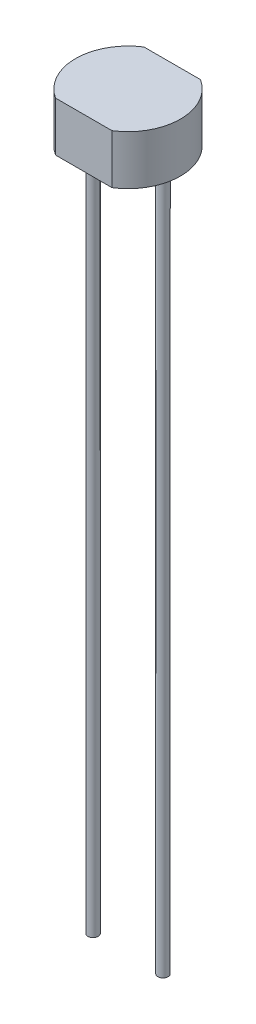
ISO-10303-21;
HEADER;
FILE_DESCRIPTION(('STEP AP214'),'2;1');
FILE_NAME('part.step','',(''),(''),'','','');
FILE_SCHEMA(('AUTOMOTIVE_DESIGN { 1 0 10303 214 1 1 1 1 }'));
ENDSEC;
DATA;
#1=APPLICATION_CONTEXT('core data for automotive mechanical design processes');
#2=APPLICATION_PROTOCOL_DEFINITION('international standard','automotive_design',2000,#1);
#3=PRODUCT_CONTEXT('',#1,'mechanical');
#4=PRODUCT('Part','Part','',(#3));
#5=PRODUCT_RELATED_PRODUCT_CATEGORY('part','',(#4));
#6=PRODUCT_DEFINITION_FORMATION('','',#4);
#7=PRODUCT_DEFINITION_CONTEXT('part definition',#1,'design');
#8=PRODUCT_DEFINITION('design','',#6,#7);
#9=PRODUCT_DEFINITION_SHAPE('','',#8);
#10=(LENGTH_UNIT() NAMED_UNIT(*) SI_UNIT(.MILLI.,.METRE.));
#11=(NAMED_UNIT(*) PLANE_ANGLE_UNIT() SI_UNIT($,.RADIAN.));
#12=(NAMED_UNIT(*) SI_UNIT($,.STERADIAN.) SOLID_ANGLE_UNIT());
#13=UNCERTAINTY_MEASURE_WITH_UNIT(LENGTH_MEASURE(1.E-05),#10,'distance_accuracy_value','');
#14=(GEOMETRIC_REPRESENTATION_CONTEXT(3) GLOBAL_UNCERTAINTY_ASSIGNED_CONTEXT((#13)) GLOBAL_UNIT_ASSIGNED_CONTEXT((#10,
#11,#12)) REPRESENTATION_CONTEXT('',''));
#15=CARTESIAN_POINT('',(0.,0.,0.));
#16=DIRECTION('',(0.,0.,1.));
#17=DIRECTION('',(1.,0.,0.));
#18=AXIS2_PLACEMENT_3D('',#15,#16,#17);
#19=CARTESIAN_POINT('',(0.,2.4,2.15));
#20=DIRECTION('',(0.,0.,1.));
#21=DIRECTION('',(1.,0.,0.));
#22=AXIS2_PLACEMENT_3D('',#19,#20,#21);
#23=PLANE('',#22);
#24=DIRECTION('',(-1.,0.,0.));
#25=VECTOR('',#24,1.);
#26=CARTESIAN_POINT('',(0.,0.,2.15));
#27=LINE('',#26,#25);
#28=CARTESIAN_POINT('',(1.37113092008021,0.,2.15));
#29=VERTEX_POINT('',#28);
#30=CARTESIAN_POINT('',(-1.37113092008021,0.,2.15));
#31=VERTEX_POINT('',#30);
#32=EDGE_CURVE('E100',#29,#31,#27,.T.);
#33=ORIENTED_EDGE('',*,*,#32,.F.);
#34=DIRECTION('',(0.,-1.,0.));
#35=VECTOR('',#34,1.);
#36=CARTESIAN_POINT('',(1.37113092008021,2.4,2.15));
#37=LINE('',#36,#35);
#38=CARTESIAN_POINT('',(1.37113092008021,2.4,2.15));
#39=VERTEX_POINT('',#38);
#40=EDGE_CURVE('E79',#39,#29,#37,.T.);
#41=ORIENTED_EDGE('',*,*,#40,.F.);
#42=DIRECTION('',(-1.,0.,0.));
#43=VECTOR('',#42,1.);
#44=CARTESIAN_POINT('',(0.,2.4,2.15));
#45=LINE('',#44,#43);
#46=CARTESIAN_POINT('',(-1.37113092008021,2.4,2.15));
#47=VERTEX_POINT('',#46);
#48=EDGE_CURVE('E87',#39,#47,#45,.T.);
#49=ORIENTED_EDGE('',*,*,#48,.T.);
#50=DIRECTION('',(0.,-1.,0.));
#51=VECTOR('',#50,1.);
#52=CARTESIAN_POINT('',(-1.37113092008021,2.4,2.15));
#53=LINE('',#52,#51);
#54=EDGE_CURVE('E75',#47,#31,#53,.T.);
#55=ORIENTED_EDGE('',*,*,#54,.T.);
#56=EDGE_LOOP('',(#33,#41,#49,#55));
#57=FACE_BOUND('',#56,.T.);
#58=ADVANCED_FACE('F35',(#57),#23,.T.);
#59=CARTESIAN_POINT('',(0.,2.4,0.));
#60=DIRECTION('',(0.,-1.,0.));
#61=DIRECTION('',(0.,0.,-1.));
#62=AXIS2_PLACEMENT_3D('',#59,#60,#61);
#63=CYLINDRICAL_SURFACE('',#62,2.55);
#64=CARTESIAN_POINT('',(0.,0.,0.));
#65=DIRECTION('',(0.,1.,0.));
#66=DIRECTION('',(0.,0.,1.));
#67=AXIS2_PLACEMENT_3D('',#64,#65,#66);
#68=CIRCLE('',#67,2.55);
#69=CARTESIAN_POINT('',(1.37113092008021,0.,-2.15));
#70=VERTEX_POINT('',#69);
#71=EDGE_CURVE('E93',#29,#70,#68,.T.);
#72=ORIENTED_EDGE('',*,*,#71,.T.);
#73=DIRECTION('',(0.,-1.,0.));
#74=VECTOR('',#73,1.);
#75=CARTESIAN_POINT('',(1.37113092008021,2.4,-2.15));
#76=LINE('',#75,#74);
#77=CARTESIAN_POINT('',(1.37113092008021,2.4,-2.15));
#78=VERTEX_POINT('',#77);
#79=EDGE_CURVE('E90',#78,#70,#76,.T.);
#80=ORIENTED_EDGE('',*,*,#79,.F.);
#81=CARTESIAN_POINT('',(0.,2.4,0.));
#82=DIRECTION('',(0.,1.,0.));
#83=DIRECTION('',(0.,0.,1.));
#84=AXIS2_PLACEMENT_3D('',#81,#82,#83);
#85=CIRCLE('',#84,2.55);
#86=EDGE_CURVE('E82',#39,#78,#85,.T.);
#87=ORIENTED_EDGE('',*,*,#86,.F.);
#88=ORIENTED_EDGE('',*,*,#40,.T.);
#89=EDGE_LOOP('',(#72,#80,#87,#88));
#90=FACE_BOUND('',#89,.T.);
#91=ADVANCED_FACE('F91',(#90),#63,.T.);
#92=CARTESIAN_POINT('',(0.,2.4,-2.15));
#93=DIRECTION('',(0.,0.,1.));
#94=DIRECTION('',(1.,0.,0.));
#95=AXIS2_PLACEMENT_3D('',#92,#93,#94);
#96=PLANE('',#95);
#97=DIRECTION('',(-1.,0.,0.));
#98=VECTOR('',#97,1.);
#99=CARTESIAN_POINT('',(0.,0.,-2.15));
#100=LINE('',#99,#98);
#101=CARTESIAN_POINT('',(-1.37113092008021,0.,-2.15));
#102=VERTEX_POINT('',#101);
#103=EDGE_CURVE('E68',#70,#102,#100,.T.);
#104=ORIENTED_EDGE('',*,*,#103,.T.);
#105=DIRECTION('',(0.,-1.,0.));
#106=VECTOR('',#105,1.);
#107=CARTESIAN_POINT('',(-1.37113092008021,2.4,-2.15));
#108=LINE('',#107,#106);
#109=CARTESIAN_POINT('',(-1.37113092008021,2.4,-2.15));
#110=VERTEX_POINT('',#109);
#111=EDGE_CURVE('E94',#110,#102,#108,.T.);
#112=ORIENTED_EDGE('',*,*,#111,.F.);
#113=DIRECTION('',(-1.,0.,0.));
#114=VECTOR('',#113,1.);
#115=CARTESIAN_POINT('',(0.,2.4,-2.15));
#116=LINE('',#115,#114);
#117=EDGE_CURVE('E86',#78,#110,#116,.T.);
#118=ORIENTED_EDGE('',*,*,#117,.F.);
#119=ORIENTED_EDGE('',*,*,#79,.T.);
#120=EDGE_LOOP('',(#104,#112,#118,#119));
#121=FACE_BOUND('',#120,.T.);
#122=ADVANCED_FACE('F96',(#121),#96,.F.);
#123=EDGE_CURVE('E105',#102,#31,#68,.T.);
#124=ORIENTED_EDGE('',*,*,#123,.T.);
#125=ORIENTED_EDGE('',*,*,#54,.F.);
#126=EDGE_CURVE('E51',#110,#47,#85,.T.);
#127=ORIENTED_EDGE('',*,*,#126,.F.);
#128=ORIENTED_EDGE('',*,*,#111,.T.);
#129=EDGE_LOOP('',(#124,#125,#127,#128));
#130=FACE_BOUND('',#129,.T.);
#131=ADVANCED_FACE('F125',(#130),#63,.T.);
#132=CARTESIAN_POINT('',(0.,2.4,0.));
#133=DIRECTION('',(0.,1.,0.));
#134=DIRECTION('',(0.,0.,1.));
#135=AXIS2_PLACEMENT_3D('',#132,#133,#134);
#136=PLANE('',#135);
#137=ORIENTED_EDGE('',*,*,#48,.F.);
#138=ORIENTED_EDGE('',*,*,#86,.T.);
#139=ORIENTED_EDGE('',*,*,#117,.T.);
#140=ORIENTED_EDGE('',*,*,#126,.T.);
#141=EDGE_LOOP('',(#137,#138,#139,#140));
#142=FACE_BOUND('',#141,.T.);
#143=ADVANCED_FACE('F84',(#142),#136,.T.);
#144=CARTESIAN_POINT('',(0.,0.,0.));
#145=DIRECTION('',(0.,1.,0.));
#146=DIRECTION('',(0.,0.,1.));
#147=AXIS2_PLACEMENT_3D('',#144,#145,#146);
#148=PLANE('',#147);
#149=CARTESIAN_POINT('',(-1.7,0.,0.));
#150=DIRECTION('',(0.,1.,0.));
#151=DIRECTION('',(0.,0.,1.));
#152=AXIS2_PLACEMENT_3D('',#149,#150,#151);
#153=CIRCLE('',#152,0.25);
#154=CARTESIAN_POINT('',(-1.7,0.,0.25));
#155=VERTEX_POINT('',#154);
#156=EDGE_CURVE('E11',#155,#155,#153,.F.);
#157=ORIENTED_EDGE('',*,*,#156,.F.);
#158=EDGE_LOOP('',(#157));
#159=FACE_BOUND('',#158,.T.);
#160=CARTESIAN_POINT('',(1.7,0.,0.));
#161=DIRECTION('',(0.,1.,0.));
#162=DIRECTION('',(0.,0.,1.));
#163=AXIS2_PLACEMENT_3D('',#160,#161,#162);
#164=CIRCLE('',#163,0.25);
#165=CARTESIAN_POINT('',(1.7,0.,0.25));
#166=VERTEX_POINT('',#165);
#167=EDGE_CURVE('E43',#166,#166,#164,.F.);
#168=ORIENTED_EDGE('',*,*,#167,.F.);
#169=EDGE_LOOP('',(#168));
#170=FACE_BOUND('',#169,.T.);
#171=ORIENTED_EDGE('',*,*,#32,.T.);
#172=ORIENTED_EDGE('',*,*,#123,.F.);
#173=ORIENTED_EDGE('',*,*,#103,.F.);
#174=ORIENTED_EDGE('',*,*,#71,.F.);
#175=EDGE_LOOP('',(#171,#172,#173,#174));
#176=FACE_BOUND('',#175,.T.);
#177=ADVANCED_FACE('F114',(#159,#170,#176),#148,.F.);
#178=CARTESIAN_POINT('',(1.7,-34.,0.));
#179=DIRECTION('',(0.,1.,0.));
#180=DIRECTION('',(0.,0.,1.));
#181=AXIS2_PLACEMENT_3D('',#178,#179,#180);
#182=CYLINDRICAL_SURFACE('',#181,0.25);
#183=CARTESIAN_POINT('',(1.7,-34.,0.));
#184=DIRECTION('',(0.,-1.,0.));
#185=DIRECTION('',(0.,0.,-1.));
#186=AXIS2_PLACEMENT_3D('',#183,#184,#185);
#187=CIRCLE('',#186,0.25);
#188=CARTESIAN_POINT('',(1.7,-34.,-0.25));
#189=VERTEX_POINT('',#188);
#190=EDGE_CURVE('E103',#189,#189,#187,.T.);
#191=ORIENTED_EDGE('',*,*,#190,.F.);
#192=EDGE_LOOP('',(#191));
#193=FACE_BOUND('',#192,.T.);
#194=ORIENTED_EDGE('',*,*,#167,.T.);
#195=EDGE_LOOP('',(#194));
#196=FACE_BOUND('',#195,.T.);
#197=ADVANCED_FACE('F112',(#193,#196),#182,.T.);
#198=CARTESIAN_POINT('',(1.7,-34.,0.));
#199=DIRECTION('',(0.,-1.,0.));
#200=DIRECTION('',(0.,0.,-1.));
#201=AXIS2_PLACEMENT_3D('',#198,#199,#200);
#202=PLANE('',#201);
#203=ORIENTED_EDGE('',*,*,#190,.T.);
#204=EDGE_LOOP('',(#203));
#205=FACE_BOUND('',#204,.T.);
#206=ADVANCED_FACE('F147',(#205),#202,.T.);
#207=CARTESIAN_POINT('',(-1.7,-34.,0.));
#208=DIRECTION('',(0.,1.,0.));
#209=DIRECTION('',(0.,0.,1.));
#210=AXIS2_PLACEMENT_3D('',#207,#208,#209);
#211=CYLINDRICAL_SURFACE('',#210,0.25);
#212=CARTESIAN_POINT('',(-1.7,-34.,0.));
#213=DIRECTION('',(0.,-1.,0.));
#214=DIRECTION('',(0.,0.,-1.));
#215=AXIS2_PLACEMENT_3D('',#212,#213,#214);
#216=CIRCLE('',#215,0.25);
#217=CARTESIAN_POINT('',(-1.7,-34.,-0.25));
#218=VERTEX_POINT('',#217);
#219=EDGE_CURVE('E138',#218,#218,#216,.T.);
#220=ORIENTED_EDGE('',*,*,#219,.F.);
#221=EDGE_LOOP('',(#220));
#222=FACE_BOUND('',#221,.T.);
#223=ORIENTED_EDGE('',*,*,#156,.T.);
#224=EDGE_LOOP('',(#223));
#225=FACE_BOUND('',#224,.T.);
#226=ADVANCED_FACE('F144',(#222,#225),#211,.T.);
#227=CARTESIAN_POINT('',(-1.7,-34.,0.));
#228=DIRECTION('',(0.,-1.,0.));
#229=DIRECTION('',(0.,0.,-1.));
#230=AXIS2_PLACEMENT_3D('',#227,#228,#229);
#231=PLANE('',#230);
#232=ORIENTED_EDGE('',*,*,#219,.T.);
#233=EDGE_LOOP('',(#232));
#234=FACE_BOUND('',#233,.T.);
#235=ADVANCED_FACE('F142',(#234),#231,.T.);
#236=CLOSED_SHELL('',(#58,#91,#122,#131,#143,#177,#197,#206,#226,#235));
#237=MANIFOLD_SOLID_BREP('B2',#236);
#238=ADVANCED_BREP_SHAPE_REPRESENTATION('',(#18,#237),#14);
#239=SHAPE_DEFINITION_REPRESENTATION(#9,#238);
ENDSEC;
END-ISO-10303-21;
